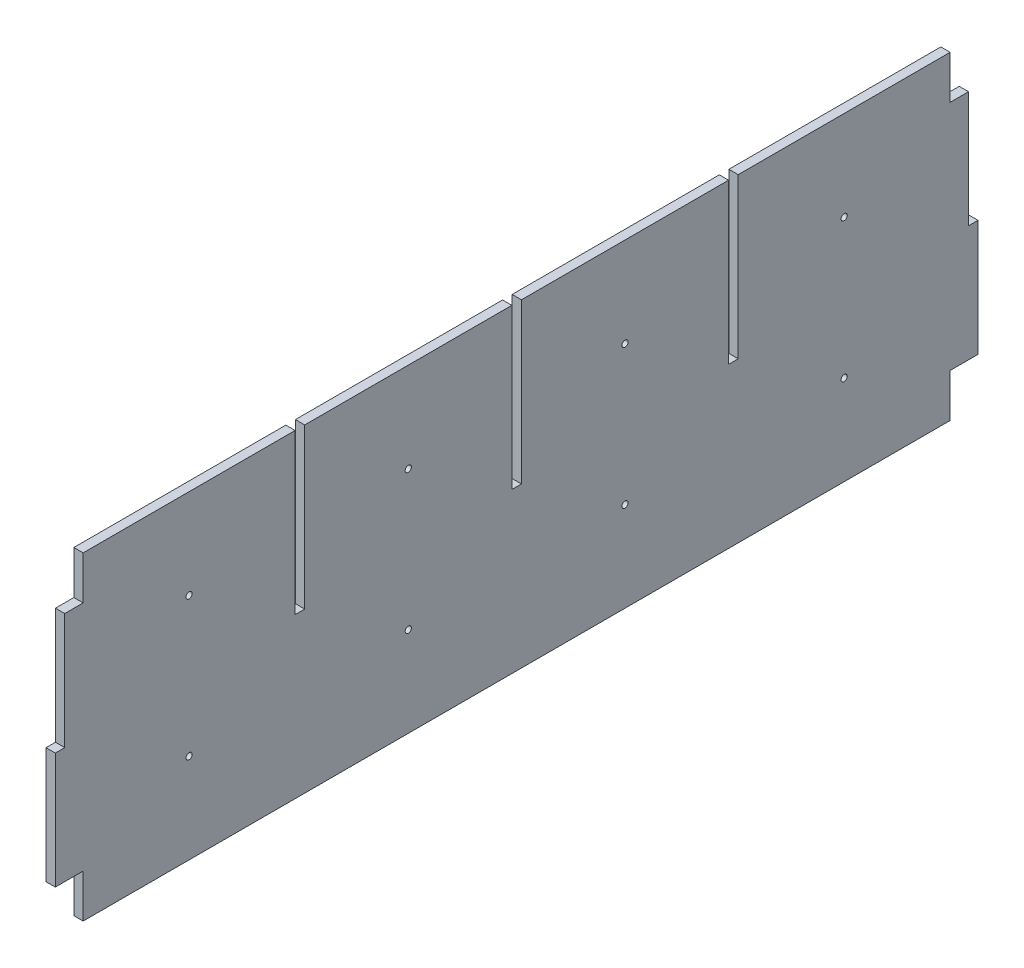
ISO-10303-21;
HEADER;
FILE_DESCRIPTION(('STEP AP214'),'2;1');
FILE_NAME('part.step','',(''),(''),'','','');
FILE_SCHEMA(('AUTOMOTIVE_DESIGN { 1 0 10303 214 1 1 1 1 }'));
ENDSEC;
DATA;
#1=APPLICATION_CONTEXT('core data for automotive mechanical design processes');
#2=APPLICATION_PROTOCOL_DEFINITION('international standard','automotive_design',2000,#1);
#3=PRODUCT_CONTEXT('',#1,'mechanical');
#4=PRODUCT('Part','Part','',(#3));
#5=PRODUCT_RELATED_PRODUCT_CATEGORY('part','',(#4));
#6=PRODUCT_DEFINITION_FORMATION('','',#4);
#7=PRODUCT_DEFINITION_CONTEXT('part definition',#1,'design');
#8=PRODUCT_DEFINITION('design','',#6,#7);
#9=PRODUCT_DEFINITION_SHAPE('','',#8);
#10=(LENGTH_UNIT() NAMED_UNIT(*) SI_UNIT(.MILLI.,.METRE.));
#11=(NAMED_UNIT(*) PLANE_ANGLE_UNIT() SI_UNIT($,.RADIAN.));
#12=(NAMED_UNIT(*) SI_UNIT($,.STERADIAN.) SOLID_ANGLE_UNIT());
#13=UNCERTAINTY_MEASURE_WITH_UNIT(LENGTH_MEASURE(1.E-05),#10,'distance_accuracy_value','');
#14=(GEOMETRIC_REPRESENTATION_CONTEXT(3) GLOBAL_UNCERTAINTY_ASSIGNED_CONTEXT((#13)) GLOBAL_UNIT_ASSIGNED_CONTEXT((#10,
#11,#12)) REPRESENTATION_CONTEXT('',''));
#15=CARTESIAN_POINT('',(0.,0.,0.));
#16=DIRECTION('',(0.,0.,1.));
#17=DIRECTION('',(1.,0.,0.));
#18=AXIS2_PLACEMENT_3D('',#15,#16,#17);
#19=CARTESIAN_POINT('',(6.,10.,0.));
#20=DIRECTION('',(0.,0.,-1.));
#21=DIRECTION('',(-1.,0.,0.));
#22=AXIS2_PLACEMENT_3D('',#19,#20,#21);
#23=PLANE('',#22);
#24=DIRECTION('',(0.,-1.,0.));
#25=VECTOR('',#24,1.);
#26=CARTESIAN_POINT('',(0.,10.,0.));
#27=LINE('',#26,#25);
#28=CARTESIAN_POINT('',(0.,10.,0.));
#29=VERTEX_POINT('',#28);
#30=CARTESIAN_POINT('',(0.,-18.,0.));
#31=VERTEX_POINT('',#30);
#32=EDGE_CURVE('E237',#29,#31,#27,.T.);
#33=ORIENTED_EDGE('',*,*,#32,.T.);
#34=DIRECTION('',(1.,0.,0.));
#35=VECTOR('',#34,1.);
#36=CARTESIAN_POINT('',(6.,-18.,0.));
#37=LINE('',#36,#35);
#38=CARTESIAN_POINT('',(6.,-18.,0.));
#39=VERTEX_POINT('',#38);
#40=EDGE_CURVE('E47',#31,#39,#37,.T.);
#41=ORIENTED_EDGE('',*,*,#40,.T.);
#42=DIRECTION('',(0.,-1.,0.));
#43=VECTOR('',#42,1.);
#44=CARTESIAN_POINT('',(6.,10.,0.));
#45=LINE('',#44,#43);
#46=CARTESIAN_POINT('',(6.,10.,0.));
#47=VERTEX_POINT('',#46);
#48=EDGE_CURVE('E267',#47,#39,#45,.T.);
#49=ORIENTED_EDGE('',*,*,#48,.F.);
#50=DIRECTION('',(-1.,0.,0.));
#51=VECTOR('',#50,1.);
#52=CARTESIAN_POINT('',(6.,10.,0.));
#53=LINE('',#52,#51);
#54=EDGE_CURVE('E268',#47,#29,#53,.T.);
#55=ORIENTED_EDGE('',*,*,#54,.T.);
#56=EDGE_LOOP('',(#33,#41,#49,#55));
#57=FACE_BOUND('',#56,.T.);
#58=ADVANCED_FACE('F33',(#57),#23,.F.);
#59=CARTESIAN_POINT('',(6.,0.,-560.));
#60=DIRECTION('',(0.,0.,1.));
#61=DIRECTION('',(1.,0.,0.));
#62=AXIS2_PLACEMENT_3D('',#59,#60,#61);
#63=PLANE('',#62);
#64=DIRECTION('',(0.,1.,0.));
#65=VECTOR('',#64,1.);
#66=CARTESIAN_POINT('',(6.,0.,-560.));
#67=LINE('',#66,#65);
#68=CARTESIAN_POINT('',(6.,-18.,-560.));
#69=VERTEX_POINT('',#68);
#70=CARTESIAN_POINT('',(6.,10.,-560.));
#71=VERTEX_POINT('',#70);
#72=EDGE_CURVE('E231',#69,#71,#67,.T.);
#73=ORIENTED_EDGE('',*,*,#72,.F.);
#74=DIRECTION('',(1.,0.,0.));
#75=VECTOR('',#74,1.);
#76=CARTESIAN_POINT('',(0.,-18.,-560.));
#77=LINE('',#76,#75);
#78=CARTESIAN_POINT('',(0.,-18.,-560.));
#79=VERTEX_POINT('',#78);
#80=EDGE_CURVE('E217',#79,#69,#77,.T.);
#81=ORIENTED_EDGE('',*,*,#80,.F.);
#82=DIRECTION('',(0.,1.,0.));
#83=VECTOR('',#82,1.);
#84=CARTESIAN_POINT('',(0.,0.,-560.));
#85=LINE('',#84,#83);
#86=CARTESIAN_POINT('',(0.,10.,-560.));
#87=VERTEX_POINT('',#86);
#88=EDGE_CURVE('E229',#79,#87,#85,.T.);
#89=ORIENTED_EDGE('',*,*,#88,.T.);
#90=DIRECTION('',(-1.,0.,0.));
#91=VECTOR('',#90,1.);
#92=CARTESIAN_POINT('',(6.,10.,-560.));
#93=LINE('',#92,#91);
#94=EDGE_CURVE('E40',#71,#87,#93,.T.);
#95=ORIENTED_EDGE('',*,*,#94,.F.);
#96=EDGE_LOOP('',(#73,#81,#89,#95));
#97=FACE_BOUND('',#96,.T.);
#98=ADVANCED_FACE('F227',(#97),#63,.F.);
#99=CARTESIAN_POINT('',(6.,10.,-560.));
#100=DIRECTION('',(0.,1.,0.));
#101=DIRECTION('',(0.,0.,1.));
#102=AXIS2_PLACEMENT_3D('',#99,#100,#101);
#103=PLANE('',#102);
#104=DIRECTION('',(0.,0.,-1.));
#105=VECTOR('',#104,1.);
#106=CARTESIAN_POINT('',(0.,10.,-560.));
#107=LINE('',#106,#105);
#108=CARTESIAN_POINT('',(0.,10.,-578.));
#109=VERTEX_POINT('',#108);
#110=EDGE_CURVE('E236',#87,#109,#107,.T.);
#111=ORIENTED_EDGE('',*,*,#110,.T.);
#112=DIRECTION('',(-1.,0.,0.));
#113=VECTOR('',#112,1.);
#114=CARTESIAN_POINT('',(6.,10.,-578.));
#115=LINE('',#114,#113);
#116=CARTESIAN_POINT('',(6.,10.,-578.));
#117=VERTEX_POINT('',#116);
#118=EDGE_CURVE('E299',#117,#109,#115,.T.);
#119=ORIENTED_EDGE('',*,*,#118,.F.);
#120=DIRECTION('',(0.,0.,-1.));
#121=VECTOR('',#120,1.);
#122=CARTESIAN_POINT('',(6.,10.,-560.));
#123=LINE('',#122,#121);
#124=EDGE_CURVE('E305',#71,#117,#123,.T.);
#125=ORIENTED_EDGE('',*,*,#124,.F.);
#126=ORIENTED_EDGE('',*,*,#94,.T.);
#127=EDGE_LOOP('',(#111,#119,#125,#126));
#128=FACE_BOUND('',#127,.T.);
#129=ADVANCED_FACE('F303',(#128),#103,.F.);
#130=CARTESIAN_POINT('',(6.,10.,-578.));
#131=DIRECTION('',(0.,0.,1.));
#132=DIRECTION('',(1.,0.,0.));
#133=AXIS2_PLACEMENT_3D('',#130,#131,#132);
#134=PLANE('',#133);
#135=DIRECTION('',(0.,1.,0.));
#136=VECTOR('',#135,1.);
#137=CARTESIAN_POINT('',(0.,10.,-578.));
#138=LINE('',#137,#136);
#139=CARTESIAN_POINT('',(0.,85.,-578.));
#140=VERTEX_POINT('',#139);
#141=EDGE_CURVE('E239',#109,#140,#138,.T.);
#142=ORIENTED_EDGE('',*,*,#141,.T.);
#143=DIRECTION('',(-1.,0.,0.));
#144=VECTOR('',#143,1.);
#145=CARTESIAN_POINT('',(6.,85.,-578.));
#146=LINE('',#145,#144);
#147=CARTESIAN_POINT('',(6.,85.,-578.));
#148=VERTEX_POINT('',#147);
#149=EDGE_CURVE('E296',#148,#140,#146,.T.);
#150=ORIENTED_EDGE('',*,*,#149,.F.);
#151=DIRECTION('',(0.,1.,0.));
#152=VECTOR('',#151,1.);
#153=CARTESIAN_POINT('',(6.,10.,-578.));
#154=LINE('',#153,#152);
#155=EDGE_CURVE('E308',#117,#148,#154,.T.);
#156=ORIENTED_EDGE('',*,*,#155,.F.);
#157=ORIENTED_EDGE('',*,*,#118,.T.);
#158=EDGE_LOOP('',(#142,#150,#156,#157));
#159=FACE_BOUND('',#158,.T.);
#160=ADVANCED_FACE('F508',(#159),#134,.F.);
#161=CARTESIAN_POINT('',(6.,85.,-578.));
#162=DIRECTION('',(0.,-1.,0.));
#163=DIRECTION('',(0.,0.,-1.));
#164=AXIS2_PLACEMENT_3D('',#161,#162,#163);
#165=PLANE('',#164);
#166=DIRECTION('',(0.,0.,1.));
#167=VECTOR('',#166,1.);
#168=CARTESIAN_POINT('',(0.,85.,-578.));
#169=LINE('',#168,#167);
#170=CARTESIAN_POINT('',(0.,85.,-571.9));
#171=VERTEX_POINT('',#170);
#172=EDGE_CURVE('E246',#140,#171,#169,.T.);
#173=ORIENTED_EDGE('',*,*,#172,.T.);
#174=DIRECTION('',(-1.,0.,0.));
#175=VECTOR('',#174,1.);
#176=CARTESIAN_POINT('',(6.,85.,-571.9));
#177=LINE('',#176,#175);
#178=CARTESIAN_POINT('',(6.,85.,-571.9));
#179=VERTEX_POINT('',#178);
#180=EDGE_CURVE('E293',#179,#171,#177,.T.);
#181=ORIENTED_EDGE('',*,*,#180,.F.);
#182=DIRECTION('',(0.,0.,1.));
#183=VECTOR('',#182,1.);
#184=CARTESIAN_POINT('',(6.,85.,-578.));
#185=LINE('',#184,#183);
#186=EDGE_CURVE('E310',#148,#179,#185,.T.);
#187=ORIENTED_EDGE('',*,*,#186,.F.);
#188=ORIENTED_EDGE('',*,*,#149,.T.);
#189=EDGE_LOOP('',(#173,#181,#187,#188));
#190=FACE_BOUND('',#189,.T.);
#191=ADVANCED_FACE('F505',(#190),#165,.F.);
#192=CARTESIAN_POINT('',(6.,85.,-571.9));
#193=DIRECTION('',(0.,0.,1.));
#194=DIRECTION('',(1.,0.,0.));
#195=AXIS2_PLACEMENT_3D('',#192,#193,#194);
#196=PLANE('',#195);
#197=DIRECTION('',(0.,1.,0.));
#198=VECTOR('',#197,1.);
#199=CARTESIAN_POINT('',(0.,85.,-571.9));
#200=LINE('',#199,#198);
#201=CARTESIAN_POINT('',(0.,160.,-571.9));
#202=VERTEX_POINT('',#201);
#203=EDGE_CURVE('E248',#171,#202,#200,.T.);
#204=ORIENTED_EDGE('',*,*,#203,.T.);
#205=DIRECTION('',(-1.,0.,0.));
#206=VECTOR('',#205,1.);
#207=CARTESIAN_POINT('',(6.,160.,-571.9));
#208=LINE('',#207,#206);
#209=CARTESIAN_POINT('',(6.,160.,-571.9));
#210=VERTEX_POINT('',#209);
#211=EDGE_CURVE('E290',#210,#202,#208,.T.);
#212=ORIENTED_EDGE('',*,*,#211,.F.);
#213=DIRECTION('',(0.,1.,0.));
#214=VECTOR('',#213,1.);
#215=CARTESIAN_POINT('',(6.,85.,-571.9));
#216=LINE('',#215,#214);
#217=EDGE_CURVE('E316',#179,#210,#216,.T.);
#218=ORIENTED_EDGE('',*,*,#217,.F.);
#219=ORIENTED_EDGE('',*,*,#180,.T.);
#220=EDGE_LOOP('',(#204,#212,#218,#219));
#221=FACE_BOUND('',#220,.T.);
#222=ADVANCED_FACE('F500',(#221),#196,.F.);
#223=CARTESIAN_POINT('',(6.,160.,-571.9));
#224=DIRECTION('',(0.,-1.,0.));
#225=DIRECTION('',(0.,0.,-1.));
#226=AXIS2_PLACEMENT_3D('',#223,#224,#225);
#227=PLANE('',#226);
#228=DIRECTION('',(0.,0.,1.));
#229=VECTOR('',#228,1.);
#230=CARTESIAN_POINT('',(0.,160.,-571.9));
#231=LINE('',#230,#229);
#232=CARTESIAN_POINT('',(0.,160.,-560.));
#233=VERTEX_POINT('',#232);
#234=EDGE_CURVE('E250',#202,#233,#231,.T.);
#235=ORIENTED_EDGE('',*,*,#234,.T.);
#236=DIRECTION('',(-1.,0.,0.));
#237=VECTOR('',#236,1.);
#238=CARTESIAN_POINT('',(6.,160.,-560.));
#239=LINE('',#238,#237);
#240=CARTESIAN_POINT('',(6.,160.,-560.));
#241=VERTEX_POINT('',#240);
#242=EDGE_CURVE('E287',#241,#233,#239,.T.);
#243=ORIENTED_EDGE('',*,*,#242,.F.);
#244=DIRECTION('',(0.,0.,1.));
#245=VECTOR('',#244,1.);
#246=CARTESIAN_POINT('',(6.,160.,-571.9));
#247=LINE('',#246,#245);
#248=EDGE_CURVE('E318',#210,#241,#247,.T.);
#249=ORIENTED_EDGE('',*,*,#248,.F.);
#250=ORIENTED_EDGE('',*,*,#211,.T.);
#251=EDGE_LOOP('',(#235,#243,#249,#250));
#252=FACE_BOUND('',#251,.T.);
#253=ADVANCED_FACE('F495',(#252),#227,.F.);
#254=CARTESIAN_POINT('',(6.,160.,-560.));
#255=DIRECTION('',(0.,0.,1.));
#256=DIRECTION('',(1.,0.,0.));
#257=AXIS2_PLACEMENT_3D('',#254,#255,#256);
#258=PLANE('',#257);
#259=DIRECTION('',(0.,1.,0.));
#260=VECTOR('',#259,1.);
#261=CARTESIAN_POINT('',(0.,160.,-560.));
#262=LINE('',#261,#260);
#263=CARTESIAN_POINT('',(0.,188.,-560.));
#264=VERTEX_POINT('',#263);
#265=EDGE_CURVE('E252',#233,#264,#262,.T.);
#266=ORIENTED_EDGE('',*,*,#265,.T.);
#267=DIRECTION('',(-1.,0.,0.));
#268=VECTOR('',#267,1.);
#269=CARTESIAN_POINT('',(6.,188.,-560.));
#270=LINE('',#269,#268);
#271=CARTESIAN_POINT('',(6.,188.,-560.));
#272=VERTEX_POINT('',#271);
#273=EDGE_CURVE('E476',#272,#264,#270,.T.);
#274=ORIENTED_EDGE('',*,*,#273,.F.);
#275=DIRECTION('',(0.,1.,0.));
#276=VECTOR('',#275,1.);
#277=CARTESIAN_POINT('',(6.,160.,-560.));
#278=LINE('',#277,#276);
#279=EDGE_CURVE('E320',#241,#272,#278,.T.);
#280=ORIENTED_EDGE('',*,*,#279,.F.);
#281=ORIENTED_EDGE('',*,*,#242,.T.);
#282=EDGE_LOOP('',(#266,#274,#280,#281));
#283=FACE_BOUND('',#282,.T.);
#284=ADVANCED_FACE('F491',(#283),#258,.F.);
#285=CARTESIAN_POINT('',(6.,170.,0.));
#286=DIRECTION('',(0.,0.,-1.));
#287=DIRECTION('',(-1.,0.,0.));
#288=AXIS2_PLACEMENT_3D('',#285,#286,#287);
#289=PLANE('',#288);
#290=DIRECTION('',(0.,-1.,0.));
#291=VECTOR('',#290,1.);
#292=CARTESIAN_POINT('',(6.,170.,0.));
#293=LINE('',#292,#291);
#294=CARTESIAN_POINT('',(6.,188.,0.));
#295=VERTEX_POINT('',#294);
#296=CARTESIAN_POINT('',(6.,160.,0.));
#297=VERTEX_POINT('',#296);
#298=EDGE_CURVE('E323',#295,#297,#293,.T.);
#299=ORIENTED_EDGE('',*,*,#298,.F.);
#300=DIRECTION('',(-1.,0.,0.));
#301=VECTOR('',#300,1.);
#302=CARTESIAN_POINT('',(6.,188.,0.));
#303=LINE('',#302,#301);
#304=CARTESIAN_POINT('',(0.,188.,0.));
#305=VERTEX_POINT('',#304);
#306=EDGE_CURVE('E418',#295,#305,#303,.T.);
#307=ORIENTED_EDGE('',*,*,#306,.T.);
#308=DIRECTION('',(0.,-1.,0.));
#309=VECTOR('',#308,1.);
#310=CARTESIAN_POINT('',(0.,170.,0.));
#311=LINE('',#310,#309);
#312=CARTESIAN_POINT('',(0.,160.,0.));
#313=VERTEX_POINT('',#312);
#314=EDGE_CURVE('E255',#305,#313,#311,.T.);
#315=ORIENTED_EDGE('',*,*,#314,.T.);
#316=DIRECTION('',(-1.,0.,0.));
#317=VECTOR('',#316,1.);
#318=CARTESIAN_POINT('',(6.,160.,0.));
#319=LINE('',#318,#317);
#320=EDGE_CURVE('E284',#297,#313,#319,.T.);
#321=ORIENTED_EDGE('',*,*,#320,.F.);
#322=EDGE_LOOP('',(#299,#307,#315,#321));
#323=FACE_BOUND('',#322,.T.);
#324=ADVANCED_FACE('F592',(#323),#289,.F.);
#325=CARTESIAN_POINT('',(6.,160.,0.));
#326=DIRECTION('',(0.,-1.,0.));
#327=DIRECTION('',(0.,0.,-1.));
#328=AXIS2_PLACEMENT_3D('',#325,#326,#327);
#329=PLANE('',#328);
#330=DIRECTION('',(0.,0.,1.));
#331=VECTOR('',#330,1.);
#332=CARTESIAN_POINT('',(0.,160.,0.));
#333=LINE('',#332,#331);
#334=CARTESIAN_POINT('',(0.,160.,11.9));
#335=VERTEX_POINT('',#334);
#336=EDGE_CURVE('E257',#313,#335,#333,.T.);
#337=ORIENTED_EDGE('',*,*,#336,.T.);
#338=DIRECTION('',(-1.,0.,0.));
#339=VECTOR('',#338,1.);
#340=CARTESIAN_POINT('',(6.,160.,11.9));
#341=LINE('',#340,#339);
#342=CARTESIAN_POINT('',(6.,160.,11.9));
#343=VERTEX_POINT('',#342);
#344=EDGE_CURVE('E281',#343,#335,#341,.T.);
#345=ORIENTED_EDGE('',*,*,#344,.F.);
#346=DIRECTION('',(0.,0.,1.));
#347=VECTOR('',#346,1.);
#348=CARTESIAN_POINT('',(6.,160.,0.));
#349=LINE('',#348,#347);
#350=EDGE_CURVE('E325',#297,#343,#349,.T.);
#351=ORIENTED_EDGE('',*,*,#350,.F.);
#352=ORIENTED_EDGE('',*,*,#320,.T.);
#353=EDGE_LOOP('',(#337,#345,#351,#352));
#354=FACE_BOUND('',#353,.T.);
#355=ADVANCED_FACE('F595',(#354),#329,.F.);
#356=CARTESIAN_POINT('',(6.,160.,11.9));
#357=DIRECTION('',(0.,0.,-1.));
#358=DIRECTION('',(-1.,0.,0.));
#359=AXIS2_PLACEMENT_3D('',#356,#357,#358);
#360=PLANE('',#359);
#361=DIRECTION('',(0.,-1.,0.));
#362=VECTOR('',#361,1.);
#363=CARTESIAN_POINT('',(0.,160.,11.9));
#364=LINE('',#363,#362);
#365=CARTESIAN_POINT('',(0.,85.,11.9));
#366=VERTEX_POINT('',#365);
#367=EDGE_CURVE('E259',#335,#366,#364,.T.);
#368=ORIENTED_EDGE('',*,*,#367,.T.);
#369=DIRECTION('',(-1.,0.,0.));
#370=VECTOR('',#369,1.);
#371=CARTESIAN_POINT('',(6.,85.,11.9));
#372=LINE('',#371,#370);
#373=CARTESIAN_POINT('',(6.,85.,11.9));
#374=VERTEX_POINT('',#373);
#375=EDGE_CURVE('E278',#374,#366,#372,.T.);
#376=ORIENTED_EDGE('',*,*,#375,.F.);
#377=DIRECTION('',(0.,-1.,0.));
#378=VECTOR('',#377,1.);
#379=CARTESIAN_POINT('',(6.,160.,11.9));
#380=LINE('',#379,#378);
#381=EDGE_CURVE('E327',#343,#374,#380,.T.);
#382=ORIENTED_EDGE('',*,*,#381,.F.);
#383=ORIENTED_EDGE('',*,*,#344,.T.);
#384=EDGE_LOOP('',(#368,#376,#382,#383));
#385=FACE_BOUND('',#384,.T.);
#386=ADVANCED_FACE('F599',(#385),#360,.F.);
#387=CARTESIAN_POINT('',(6.,85.,11.9));
#388=DIRECTION('',(0.,-1.,0.));
#389=DIRECTION('',(0.,0.,-1.));
#390=AXIS2_PLACEMENT_3D('',#387,#388,#389);
#391=PLANE('',#390);
#392=DIRECTION('',(0.,0.,1.));
#393=VECTOR('',#392,1.);
#394=CARTESIAN_POINT('',(0.,85.,11.9));
#395=LINE('',#394,#393);
#396=CARTESIAN_POINT('',(0.,85.,18.));
#397=VERTEX_POINT('',#396);
#398=EDGE_CURVE('E261',#366,#397,#395,.T.);
#399=ORIENTED_EDGE('',*,*,#398,.T.);
#400=DIRECTION('',(-1.,0.,0.));
#401=VECTOR('',#400,1.);
#402=CARTESIAN_POINT('',(6.,85.,18.));
#403=LINE('',#402,#401);
#404=CARTESIAN_POINT('',(6.,85.,18.));
#405=VERTEX_POINT('',#404);
#406=EDGE_CURVE('E275',#405,#397,#403,.T.);
#407=ORIENTED_EDGE('',*,*,#406,.F.);
#408=DIRECTION('',(0.,0.,1.));
#409=VECTOR('',#408,1.);
#410=CARTESIAN_POINT('',(6.,85.,11.9));
#411=LINE('',#410,#409);
#412=EDGE_CURVE('E329',#374,#405,#411,.T.);
#413=ORIENTED_EDGE('',*,*,#412,.F.);
#414=ORIENTED_EDGE('',*,*,#375,.T.);
#415=EDGE_LOOP('',(#399,#407,#413,#414));
#416=FACE_BOUND('',#415,.T.);
#417=ADVANCED_FACE('F603',(#416),#391,.F.);
#418=CARTESIAN_POINT('',(6.,85.,18.));
#419=DIRECTION('',(0.,0.,-1.));
#420=DIRECTION('',(-1.,0.,0.));
#421=AXIS2_PLACEMENT_3D('',#418,#419,#420);
#422=PLANE('',#421);
#423=DIRECTION('',(0.,-1.,0.));
#424=VECTOR('',#423,1.);
#425=CARTESIAN_POINT('',(0.,85.,18.));
#426=LINE('',#425,#424);
#427=CARTESIAN_POINT('',(0.,10.,18.));
#428=VERTEX_POINT('',#427);
#429=EDGE_CURVE('E263',#397,#428,#426,.T.);
#430=ORIENTED_EDGE('',*,*,#429,.T.);
#431=DIRECTION('',(-1.,0.,0.));
#432=VECTOR('',#431,1.);
#433=CARTESIAN_POINT('',(6.,10.,18.));
#434=LINE('',#433,#432);
#435=CARTESIAN_POINT('',(6.,10.,18.));
#436=VERTEX_POINT('',#435);
#437=EDGE_CURVE('E271',#436,#428,#434,.T.);
#438=ORIENTED_EDGE('',*,*,#437,.F.);
#439=DIRECTION('',(0.,-1.,0.));
#440=VECTOR('',#439,1.);
#441=CARTESIAN_POINT('',(6.,85.,18.));
#442=LINE('',#441,#440);
#443=EDGE_CURVE('E331',#405,#436,#442,.T.);
#444=ORIENTED_EDGE('',*,*,#443,.F.);
#445=ORIENTED_EDGE('',*,*,#406,.T.);
#446=EDGE_LOOP('',(#430,#438,#444,#445));
#447=FACE_BOUND('',#446,.T.);
#448=ADVANCED_FACE('F607',(#447),#422,.F.);
#449=CARTESIAN_POINT('',(6.,10.,18.));
#450=DIRECTION('',(0.,1.,0.));
#451=DIRECTION('',(0.,0.,1.));
#452=AXIS2_PLACEMENT_3D('',#449,#450,#451);
#453=PLANE('',#452);
#454=DIRECTION('',(0.,0.,-1.));
#455=VECTOR('',#454,1.);
#456=CARTESIAN_POINT('',(0.,10.,18.));
#457=LINE('',#456,#455);
#458=EDGE_CURVE('E265',#428,#29,#457,.T.);
#459=ORIENTED_EDGE('',*,*,#458,.T.);
#460=ORIENTED_EDGE('',*,*,#54,.F.);
#461=DIRECTION('',(0.,0.,-1.));
#462=VECTOR('',#461,1.);
#463=CARTESIAN_POINT('',(6.,10.,18.));
#464=LINE('',#463,#462);
#465=EDGE_CURVE('E272',#436,#47,#464,.T.);
#466=ORIENTED_EDGE('',*,*,#465,.F.);
#467=ORIENTED_EDGE('',*,*,#437,.T.);
#468=EDGE_LOOP('',(#459,#460,#466,#467));
#469=FACE_BOUND('',#468,.T.);
#470=ADVANCED_FACE('F341',(#469),#453,.F.);
#471=CARTESIAN_POINT('',(6.,0.,0.));
#472=DIRECTION('',(1.,0.,0.));
#473=DIRECTION('',(0.,0.,-1.));
#474=AXIS2_PLACEMENT_3D('',#471,#472,#473);
#475=PLANE('',#474);
#476=DIRECTION('',(0.,0.,-1.));
#477=VECTOR('',#476,1.);
#478=CARTESIAN_POINT('',(6.,-18.,440.));
#479=LINE('',#478,#477);
#480=EDGE_CURVE('E223',#39,#69,#479,.T.);
#481=ORIENTED_EDGE('',*,*,#480,.T.);
#482=ORIENTED_EDGE('',*,*,#72,.T.);
#483=ORIENTED_EDGE('',*,*,#124,.T.);
#484=ORIENTED_EDGE('',*,*,#155,.T.);
#485=ORIENTED_EDGE('',*,*,#186,.T.);
#486=ORIENTED_EDGE('',*,*,#217,.T.);
#487=ORIENTED_EDGE('',*,*,#248,.T.);
#488=ORIENTED_EDGE('',*,*,#279,.T.);
#489=DIRECTION('',(0.,0.,-1.));
#490=VECTOR('',#489,1.);
#491=CARTESIAN_POINT('',(6.,188.,440.));
#492=LINE('',#491,#490);
#493=CARTESIAN_POINT('',(6.,188.,-423.1));
#494=VERTEX_POINT('',#493);
#495=EDGE_CURVE('E473',#494,#272,#492,.T.);
#496=ORIENTED_EDGE('',*,*,#495,.F.);
#497=DIRECTION('',(0.,1.,0.));
#498=VECTOR('',#497,1.);
#499=CARTESIAN_POINT('',(6.,170.,-423.1));
#500=LINE('',#499,#498);
#501=CARTESIAN_POINT('',(6.,85.,-423.1));
#502=VERTEX_POINT('',#501);
#503=EDGE_CURVE('E373',#502,#494,#500,.T.);
#504=ORIENTED_EDGE('',*,*,#503,.F.);
#505=DIRECTION('',(0.,0.,-1.));
#506=VECTOR('',#505,1.);
#507=CARTESIAN_POINT('',(6.,85.,-416.9));
#508=LINE('',#507,#506);
#509=CARTESIAN_POINT('',(6.,85.,-416.9));
#510=VERTEX_POINT('',#509);
#511=EDGE_CURVE('E377',#510,#502,#508,.T.);
#512=ORIENTED_EDGE('',*,*,#511,.F.);
#513=DIRECTION('',(0.,-1.,0.));
#514=VECTOR('',#513,1.);
#515=CARTESIAN_POINT('',(6.,170.,-416.9));
#516=LINE('',#515,#514);
#517=CARTESIAN_POINT('',(6.,188.,-416.9));
#518=VERTEX_POINT('',#517);
#519=EDGE_CURVE('E380',#518,#510,#516,.T.);
#520=ORIENTED_EDGE('',*,*,#519,.F.);
#521=CARTESIAN_POINT('',(6.,188.,-283.1));
#522=VERTEX_POINT('',#521);
#523=EDGE_CURVE('E475',#522,#518,#492,.T.);
#524=ORIENTED_EDGE('',*,*,#523,.F.);
#525=DIRECTION('',(0.,1.,0.));
#526=VECTOR('',#525,1.);
#527=CARTESIAN_POINT('',(6.,170.,-283.1));
#528=LINE('',#527,#526);
#529=CARTESIAN_POINT('',(6.,85.,-283.1));
#530=VERTEX_POINT('',#529);
#531=EDGE_CURVE('E394',#530,#522,#528,.T.);
#532=ORIENTED_EDGE('',*,*,#531,.F.);
#533=DIRECTION('',(0.,0.,-1.));
#534=VECTOR('',#533,1.);
#535=CARTESIAN_POINT('',(6.,85.,-276.9));
#536=LINE('',#535,#534);
#537=CARTESIAN_POINT('',(6.,85.,-276.9));
#538=VERTEX_POINT('',#537);
#539=EDGE_CURVE('E398',#538,#530,#536,.T.);
#540=ORIENTED_EDGE('',*,*,#539,.F.);
#541=DIRECTION('',(0.,-1.,0.));
#542=VECTOR('',#541,1.);
#543=CARTESIAN_POINT('',(6.,170.,-276.9));
#544=LINE('',#543,#542);
#545=CARTESIAN_POINT('',(6.,188.,-276.9));
#546=VERTEX_POINT('',#545);
#547=EDGE_CURVE('E372',#546,#538,#544,.T.);
#548=ORIENTED_EDGE('',*,*,#547,.F.);
#549=CARTESIAN_POINT('',(6.,188.,-143.1));
#550=VERTEX_POINT('',#549);
#551=EDGE_CURVE('E549',#550,#546,#492,.T.);
#552=ORIENTED_EDGE('',*,*,#551,.F.);
#553=DIRECTION('',(0.,1.,0.));
#554=VECTOR('',#553,1.);
#555=CARTESIAN_POINT('',(6.,170.,-143.1));
#556=LINE('',#555,#554);
#557=CARTESIAN_POINT('',(6.,85.,-143.1));
#558=VERTEX_POINT('',#557);
#559=EDGE_CURVE('E350',#558,#550,#556,.T.);
#560=ORIENTED_EDGE('',*,*,#559,.F.);
#561=DIRECTION('',(0.,0.,-1.));
#562=VECTOR('',#561,1.);
#563=CARTESIAN_POINT('',(6.,85.,-136.9));
#564=LINE('',#563,#562);
#565=CARTESIAN_POINT('',(6.,85.,-136.9));
#566=VERTEX_POINT('',#565);
#567=EDGE_CURVE('E354',#566,#558,#564,.T.);
#568=ORIENTED_EDGE('',*,*,#567,.F.);
#569=DIRECTION('',(0.,-1.,0.));
#570=VECTOR('',#569,1.);
#571=CARTESIAN_POINT('',(6.,170.,-136.9));
#572=LINE('',#571,#570);
#573=CARTESIAN_POINT('',(6.,188.,-136.9));
#574=VERTEX_POINT('',#573);
#575=EDGE_CURVE('E357',#574,#566,#572,.T.);
#576=ORIENTED_EDGE('',*,*,#575,.F.);
#577=EDGE_CURVE('E55',#295,#574,#492,.T.);
#578=ORIENTED_EDGE('',*,*,#577,.F.);
#579=ORIENTED_EDGE('',*,*,#298,.T.);
#580=ORIENTED_EDGE('',*,*,#350,.T.);
#581=ORIENTED_EDGE('',*,*,#381,.T.);
#582=ORIENTED_EDGE('',*,*,#412,.T.);
#583=ORIENTED_EDGE('',*,*,#443,.T.);
#584=ORIENTED_EDGE('',*,*,#465,.T.);
#585=ORIENTED_EDGE('',*,*,#48,.T.);
#586=EDGE_LOOP('',(#481,#482,#483,#484,#485,#486,#487,#488,#496,#504,#512,#520,#524,#532,#540,
#548,#552,#560,#568,#576,#578,#579,#580,#581,#582,#583,#584,#585));
#587=FACE_BOUND('',#586,.T.);
#588=CARTESIAN_POINT('',(6.,40.,-68.45));
#589=DIRECTION('',(1.,0.,0.));
#590=DIRECTION('',(0.,0.,-1.));
#591=AXIS2_PLACEMENT_3D('',#588,#589,#590);
#592=CIRCLE('',#591,2.);
#593=CARTESIAN_POINT('',(6.,40.,-70.45));
#594=VERTEX_POINT('',#593);
#595=EDGE_CURVE('E451',#594,#594,#592,.T.);
#596=ORIENTED_EDGE('',*,*,#595,.F.);
#597=EDGE_LOOP('',(#596));
#598=FACE_BOUND('',#597,.T.);
#599=CARTESIAN_POINT('',(6.,130.,-210.));
#600=DIRECTION('',(1.,0.,0.));
#601=DIRECTION('',(0.,0.,-1.));
#602=AXIS2_PLACEMENT_3D('',#599,#600,#601);
#603=CIRCLE('',#602,2.);
#604=CARTESIAN_POINT('',(6.,130.,-212.));
#605=VERTEX_POINT('',#604);
#606=EDGE_CURVE('E445',#605,#605,#603,.T.);
#607=ORIENTED_EDGE('',*,*,#606,.F.);
#608=EDGE_LOOP('',(#607));
#609=FACE_BOUND('',#608,.T.);
#610=CARTESIAN_POINT('',(6.,40.,-210.));
#611=DIRECTION('',(1.,0.,0.));
#612=DIRECTION('',(0.,0.,-1.));
#613=AXIS2_PLACEMENT_3D('',#610,#611,#612);
#614=CIRCLE('',#613,2.);
#615=CARTESIAN_POINT('',(6.,40.,-212.));
#616=VERTEX_POINT('',#615);
#617=EDGE_CURVE('E439',#616,#616,#614,.T.);
#618=ORIENTED_EDGE('',*,*,#617,.F.);
#619=EDGE_LOOP('',(#618));
#620=FACE_BOUND('',#619,.T.);
#621=CARTESIAN_POINT('',(6.,130.,-350.));
#622=DIRECTION('',(1.,0.,0.));
#623=DIRECTION('',(0.,0.,-1.));
#624=AXIS2_PLACEMENT_3D('',#621,#622,#623);
#625=CIRCLE('',#624,2.);
#626=CARTESIAN_POINT('',(6.,130.,-352.));
#627=VERTEX_POINT('',#626);
#628=EDGE_CURVE('E433',#627,#627,#625,.T.);
#629=ORIENTED_EDGE('',*,*,#628,.F.);
#630=EDGE_LOOP('',(#629));
#631=FACE_BOUND('',#630,.T.);
#632=CARTESIAN_POINT('',(6.,40.,-350.));
#633=DIRECTION('',(1.,0.,0.));
#634=DIRECTION('',(0.,0.,-1.));
#635=AXIS2_PLACEMENT_3D('',#632,#633,#634);
#636=CIRCLE('',#635,2.);
#637=CARTESIAN_POINT('',(6.,40.,-352.));
#638=VERTEX_POINT('',#637);
#639=EDGE_CURVE('E427',#638,#638,#636,.T.);
#640=ORIENTED_EDGE('',*,*,#639,.F.);
#641=EDGE_LOOP('',(#640));
#642=FACE_BOUND('',#641,.T.);
#643=CARTESIAN_POINT('',(6.,130.,-491.55));
#644=DIRECTION('',(1.,0.,0.));
#645=DIRECTION('',(0.,0.,-1.));
#646=AXIS2_PLACEMENT_3D('',#643,#644,#645);
#647=CIRCLE('',#646,2.);
#648=CARTESIAN_POINT('',(6.,130.,-493.55));
#649=VERTEX_POINT('',#648);
#650=EDGE_CURVE('E421',#649,#649,#647,.T.);
#651=ORIENTED_EDGE('',*,*,#650,.F.);
#652=EDGE_LOOP('',(#651));
#653=FACE_BOUND('',#652,.T.);
#654=CARTESIAN_POINT('',(6.,40.,-491.55));
#655=DIRECTION('',(1.,0.,0.));
#656=DIRECTION('',(0.,0.,-1.));
#657=AXIS2_PLACEMENT_3D('',#654,#655,#656);
#658=CIRCLE('',#657,2.);
#659=CARTESIAN_POINT('',(6.,40.,-493.55));
#660=VERTEX_POINT('',#659);
#661=EDGE_CURVE('E414',#660,#660,#658,.T.);
#662=ORIENTED_EDGE('',*,*,#661,.F.);
#663=EDGE_LOOP('',(#662));
#664=FACE_BOUND('',#663,.T.);
#665=CARTESIAN_POINT('',(6.,130.,-68.45));
#666=DIRECTION('',(1.,0.,0.));
#667=DIRECTION('',(0.,0.,-1.));
#668=AXIS2_PLACEMENT_3D('',#665,#666,#667);
#669=CIRCLE('',#668,2.);
#670=CARTESIAN_POINT('',(6.,130.,-70.45));
#671=VERTEX_POINT('',#670);
#672=EDGE_CURVE('E408',#671,#671,#669,.T.);
#673=ORIENTED_EDGE('',*,*,#672,.F.);
#674=EDGE_LOOP('',(#673));
#675=FACE_BOUND('',#674,.T.);
#676=ADVANCED_FACE('F335',(#587,#598,#609,#620,#631,#642,#653,#664,#675),#475,.T.);
#677=CARTESIAN_POINT('',(0.,0.,0.));
#678=DIRECTION('',(1.,0.,0.));
#679=DIRECTION('',(0.,0.,-1.));
#680=AXIS2_PLACEMENT_3D('',#677,#678,#679);
#681=PLANE('',#680);
#682=CARTESIAN_POINT('',(0.,40.,-68.45));
#683=DIRECTION('',(1.,0.,0.));
#684=DIRECTION('',(0.,0.,-1.));
#685=AXIS2_PLACEMENT_3D('',#682,#683,#684);
#686=CIRCLE('',#685,2.);
#687=CARTESIAN_POINT('',(0.,40.,-70.45));
#688=VERTEX_POINT('',#687);
#689=EDGE_CURVE('E411',#688,#688,#686,.T.);
#690=ORIENTED_EDGE('',*,*,#689,.T.);
#691=EDGE_LOOP('',(#690));
#692=FACE_BOUND('',#691,.T.);
#693=CARTESIAN_POINT('',(0.,130.,-210.));
#694=DIRECTION('',(1.,0.,0.));
#695=DIRECTION('',(0.,0.,-1.));
#696=AXIS2_PLACEMENT_3D('',#693,#694,#695);
#697=CIRCLE('',#696,2.);
#698=CARTESIAN_POINT('',(0.,130.,-212.));
#699=VERTEX_POINT('',#698);
#700=EDGE_CURVE('E448',#699,#699,#697,.T.);
#701=ORIENTED_EDGE('',*,*,#700,.T.);
#702=EDGE_LOOP('',(#701));
#703=FACE_BOUND('',#702,.T.);
#704=CARTESIAN_POINT('',(0.,40.,-210.));
#705=DIRECTION('',(1.,0.,0.));
#706=DIRECTION('',(0.,0.,-1.));
#707=AXIS2_PLACEMENT_3D('',#704,#705,#706);
#708=CIRCLE('',#707,2.);
#709=CARTESIAN_POINT('',(0.,40.,-212.));
#710=VERTEX_POINT('',#709);
#711=EDGE_CURVE('E442',#710,#710,#708,.T.);
#712=ORIENTED_EDGE('',*,*,#711,.T.);
#713=EDGE_LOOP('',(#712));
#714=FACE_BOUND('',#713,.T.);
#715=CARTESIAN_POINT('',(0.,130.,-350.));
#716=DIRECTION('',(1.,0.,0.));
#717=DIRECTION('',(0.,0.,-1.));
#718=AXIS2_PLACEMENT_3D('',#715,#716,#717);
#719=CIRCLE('',#718,2.);
#720=CARTESIAN_POINT('',(0.,130.,-352.));
#721=VERTEX_POINT('',#720);
#722=EDGE_CURVE('E436',#721,#721,#719,.T.);
#723=ORIENTED_EDGE('',*,*,#722,.T.);
#724=EDGE_LOOP('',(#723));
#725=FACE_BOUND('',#724,.T.);
#726=CARTESIAN_POINT('',(0.,40.,-350.));
#727=DIRECTION('',(1.,0.,0.));
#728=DIRECTION('',(0.,0.,-1.));
#729=AXIS2_PLACEMENT_3D('',#726,#727,#728);
#730=CIRCLE('',#729,2.);
#731=CARTESIAN_POINT('',(0.,40.,-352.));
#732=VERTEX_POINT('',#731);
#733=EDGE_CURVE('E430',#732,#732,#730,.T.);
#734=ORIENTED_EDGE('',*,*,#733,.T.);
#735=EDGE_LOOP('',(#734));
#736=FACE_BOUND('',#735,.T.);
#737=CARTESIAN_POINT('',(0.,130.,-491.55));
#738=DIRECTION('',(1.,0.,0.));
#739=DIRECTION('',(0.,0.,-1.));
#740=AXIS2_PLACEMENT_3D('',#737,#738,#739);
#741=CIRCLE('',#740,2.);
#742=CARTESIAN_POINT('',(0.,130.,-493.55));
#743=VERTEX_POINT('',#742);
#744=EDGE_CURVE('E424',#743,#743,#741,.T.);
#745=ORIENTED_EDGE('',*,*,#744,.T.);
#746=EDGE_LOOP('',(#745));
#747=FACE_BOUND('',#746,.T.);
#748=CARTESIAN_POINT('',(0.,40.,-491.55));
#749=DIRECTION('',(1.,0.,0.));
#750=DIRECTION('',(0.,0.,-1.));
#751=AXIS2_PLACEMENT_3D('',#748,#749,#750);
#752=CIRCLE('',#751,2.);
#753=CARTESIAN_POINT('',(0.,40.,-493.55));
#754=VERTEX_POINT('',#753);
#755=EDGE_CURVE('E417',#754,#754,#752,.T.);
#756=ORIENTED_EDGE('',*,*,#755,.T.);
#757=EDGE_LOOP('',(#756));
#758=FACE_BOUND('',#757,.T.);
#759=CARTESIAN_POINT('',(0.,130.,-68.45));
#760=DIRECTION('',(1.,0.,0.));
#761=DIRECTION('',(0.,0.,-1.));
#762=AXIS2_PLACEMENT_3D('',#759,#760,#761);
#763=CIRCLE('',#762,2.);
#764=CARTESIAN_POINT('',(0.,130.,-70.45));
#765=VERTEX_POINT('',#764);
#766=EDGE_CURVE('E382',#765,#765,#763,.T.);
#767=ORIENTED_EDGE('',*,*,#766,.T.);
#768=EDGE_LOOP('',(#767));
#769=FACE_BOUND('',#768,.T.);
#770=ORIENTED_EDGE('',*,*,#88,.F.);
#771=DIRECTION('',(0.,0.,-1.));
#772=VECTOR('',#771,1.);
#773=CARTESIAN_POINT('',(0.,-18.,440.));
#774=LINE('',#773,#772);
#775=EDGE_CURVE('E214',#31,#79,#774,.T.);
#776=ORIENTED_EDGE('',*,*,#775,.F.);
#777=ORIENTED_EDGE('',*,*,#32,.F.);
#778=ORIENTED_EDGE('',*,*,#458,.F.);
#779=ORIENTED_EDGE('',*,*,#429,.F.);
#780=ORIENTED_EDGE('',*,*,#398,.F.);
#781=ORIENTED_EDGE('',*,*,#367,.F.);
#782=ORIENTED_EDGE('',*,*,#336,.F.);
#783=ORIENTED_EDGE('',*,*,#314,.F.);
#784=DIRECTION('',(0.,0.,-1.));
#785=VECTOR('',#784,1.);
#786=CARTESIAN_POINT('',(0.,188.,440.));
#787=LINE('',#786,#785);
#788=CARTESIAN_POINT('',(0.,188.,-136.9));
#789=VERTEX_POINT('',#788);
#790=EDGE_CURVE('E472',#305,#789,#787,.T.);
#791=ORIENTED_EDGE('',*,*,#790,.T.);
#792=DIRECTION('',(0.,-1.,0.));
#793=VECTOR('',#792,1.);
#794=CARTESIAN_POINT('',(0.,170.,-136.9));
#795=LINE('',#794,#793);
#796=CARTESIAN_POINT('',(0.,85.,-136.9));
#797=VERTEX_POINT('',#796);
#798=EDGE_CURVE('E353',#789,#797,#795,.T.);
#799=ORIENTED_EDGE('',*,*,#798,.T.);
#800=DIRECTION('',(0.,0.,-1.));
#801=VECTOR('',#800,1.);
#802=CARTESIAN_POINT('',(0.,85.,-136.9));
#803=LINE('',#802,#801);
#804=CARTESIAN_POINT('',(0.,85.,-143.1));
#805=VERTEX_POINT('',#804);
#806=EDGE_CURVE('E362',#797,#805,#803,.T.);
#807=ORIENTED_EDGE('',*,*,#806,.T.);
#808=DIRECTION('',(0.,1.,0.));
#809=VECTOR('',#808,1.);
#810=CARTESIAN_POINT('',(0.,170.,-143.1));
#811=LINE('',#810,#809);
#812=CARTESIAN_POINT('',(0.,188.,-143.1));
#813=VERTEX_POINT('',#812);
#814=EDGE_CURVE('E348',#805,#813,#811,.T.);
#815=ORIENTED_EDGE('',*,*,#814,.T.);
#816=CARTESIAN_POINT('',(0.,188.,-276.9));
#817=VERTEX_POINT('',#816);
#818=EDGE_CURVE('E527',#813,#817,#787,.T.);
#819=ORIENTED_EDGE('',*,*,#818,.T.);
#820=DIRECTION('',(0.,-1.,0.));
#821=VECTOR('',#820,1.);
#822=CARTESIAN_POINT('',(0.,170.,-276.9));
#823=LINE('',#822,#821);
#824=CARTESIAN_POINT('',(0.,85.,-276.9));
#825=VERTEX_POINT('',#824);
#826=EDGE_CURVE('E397',#817,#825,#823,.T.);
#827=ORIENTED_EDGE('',*,*,#826,.T.);
#828=DIRECTION('',(0.,0.,-1.));
#829=VECTOR('',#828,1.);
#830=CARTESIAN_POINT('',(0.,85.,-276.9));
#831=LINE('',#830,#829);
#832=CARTESIAN_POINT('',(0.,85.,-283.1));
#833=VERTEX_POINT('',#832);
#834=EDGE_CURVE('E404',#825,#833,#831,.T.);
#835=ORIENTED_EDGE('',*,*,#834,.T.);
#836=DIRECTION('',(0.,1.,0.));
#837=VECTOR('',#836,1.);
#838=CARTESIAN_POINT('',(0.,170.,-283.1));
#839=LINE('',#838,#837);
#840=CARTESIAN_POINT('',(0.,188.,-283.1));
#841=VERTEX_POINT('',#840);
#842=EDGE_CURVE('E392',#833,#841,#839,.T.);
#843=ORIENTED_EDGE('',*,*,#842,.T.);
#844=CARTESIAN_POINT('',(0.,188.,-416.9));
#845=VERTEX_POINT('',#844);
#846=EDGE_CURVE('E480',#841,#845,#787,.T.);
#847=ORIENTED_EDGE('',*,*,#846,.T.);
#848=DIRECTION('',(0.,-1.,0.));
#849=VECTOR('',#848,1.);
#850=CARTESIAN_POINT('',(0.,170.,-416.9));
#851=LINE('',#850,#849);
#852=CARTESIAN_POINT('',(0.,85.,-416.9));
#853=VERTEX_POINT('',#852);
#854=EDGE_CURVE('E376',#845,#853,#851,.T.);
#855=ORIENTED_EDGE('',*,*,#854,.T.);
#856=DIRECTION('',(0.,0.,-1.));
#857=VECTOR('',#856,1.);
#858=CARTESIAN_POINT('',(0.,85.,-416.9));
#859=LINE('',#858,#857);
#860=CARTESIAN_POINT('',(0.,85.,-423.1));
#861=VERTEX_POINT('',#860);
#862=EDGE_CURVE('E385',#853,#861,#859,.T.);
#863=ORIENTED_EDGE('',*,*,#862,.T.);
#864=DIRECTION('',(0.,1.,0.));
#865=VECTOR('',#864,1.);
#866=CARTESIAN_POINT('',(0.,170.,-423.1));
#867=LINE('',#866,#865);
#868=CARTESIAN_POINT('',(0.,188.,-423.1));
#869=VERTEX_POINT('',#868);
#870=EDGE_CURVE('E370',#861,#869,#867,.T.);
#871=ORIENTED_EDGE('',*,*,#870,.T.);
#872=EDGE_CURVE('E477',#869,#264,#787,.T.);
#873=ORIENTED_EDGE('',*,*,#872,.T.);
#874=ORIENTED_EDGE('',*,*,#265,.F.);
#875=ORIENTED_EDGE('',*,*,#234,.F.);
#876=ORIENTED_EDGE('',*,*,#203,.F.);
#877=ORIENTED_EDGE('',*,*,#172,.F.);
#878=ORIENTED_EDGE('',*,*,#141,.F.);
#879=ORIENTED_EDGE('',*,*,#110,.F.);
#880=EDGE_LOOP('',(#770,#776,#777,#778,#779,#780,#781,#782,#783,#791,#799,#807,#815,#819,#827,
#835,#843,#847,#855,#863,#871,#873,#874,#875,#876,#877,#878,#879));
#881=FACE_BOUND('',#880,.T.);
#882=ADVANCED_FACE('F234',(#692,#703,#714,#725,#736,#747,#758,#769,#881),#681,.F.);
#883=CARTESIAN_POINT('',(0.,170.,-136.9));
#884=DIRECTION('',(0.,0.,1.));
#885=DIRECTION('',(1.,0.,0.));
#886=AXIS2_PLACEMENT_3D('',#883,#884,#885);
#887=PLANE('',#886);
#888=ORIENTED_EDGE('',*,*,#798,.F.);
#889=DIRECTION('',(1.,0.,0.));
#890=VECTOR('',#889,1.);
#891=CARTESIAN_POINT('',(0.,188.,-136.9));
#892=LINE('',#891,#890);
#893=EDGE_CURVE('E458',#789,#574,#892,.T.);
#894=ORIENTED_EDGE('',*,*,#893,.T.);
#895=ORIENTED_EDGE('',*,*,#575,.T.);
#896=DIRECTION('',(1.,0.,0.));
#897=VECTOR('',#896,1.);
#898=CARTESIAN_POINT('',(0.,85.,-136.9));
#899=LINE('',#898,#897);
#900=EDGE_CURVE('E345',#797,#566,#899,.T.);
#901=ORIENTED_EDGE('',*,*,#900,.F.);
#902=EDGE_LOOP('',(#888,#894,#895,#901));
#903=FACE_BOUND('',#902,.T.);
#904=ADVANCED_FACE('F536',(#903),#887,.F.);
#905=CARTESIAN_POINT('',(0.,170.,-143.1));
#906=DIRECTION('',(0.,0.,-1.));
#907=DIRECTION('',(-1.,0.,0.));
#908=AXIS2_PLACEMENT_3D('',#905,#906,#907);
#909=PLANE('',#908);
#910=ORIENTED_EDGE('',*,*,#559,.T.);
#911=DIRECTION('',(-1.,0.,0.));
#912=VECTOR('',#911,1.);
#913=CARTESIAN_POINT('',(0.,188.,-143.1));
#914=LINE('',#913,#912);
#915=EDGE_CURVE('E460',#550,#813,#914,.T.);
#916=ORIENTED_EDGE('',*,*,#915,.T.);
#917=ORIENTED_EDGE('',*,*,#814,.F.);
#918=DIRECTION('',(1.,0.,0.));
#919=VECTOR('',#918,1.);
#920=CARTESIAN_POINT('',(0.,85.,-143.1));
#921=LINE('',#920,#919);
#922=EDGE_CURVE('E241',#805,#558,#921,.T.);
#923=ORIENTED_EDGE('',*,*,#922,.T.);
#924=EDGE_LOOP('',(#910,#916,#917,#923));
#925=FACE_BOUND('',#924,.T.);
#926=ADVANCED_FACE('F544',(#925),#909,.F.);
#927=CARTESIAN_POINT('',(0.,85.,-136.9));
#928=DIRECTION('',(0.,-1.,0.));
#929=DIRECTION('',(0.,0.,-1.));
#930=AXIS2_PLACEMENT_3D('',#927,#928,#929);
#931=PLANE('',#930);
#932=ORIENTED_EDGE('',*,*,#567,.T.);
#933=ORIENTED_EDGE('',*,*,#922,.F.);
#934=ORIENTED_EDGE('',*,*,#806,.F.);
#935=ORIENTED_EDGE('',*,*,#900,.T.);
#936=EDGE_LOOP('',(#932,#933,#934,#935));
#937=FACE_BOUND('',#936,.T.);
#938=ADVANCED_FACE('F542',(#937),#931,.F.);
#939=CARTESIAN_POINT('',(0.,170.,-416.9));
#940=DIRECTION('',(0.,0.,1.));
#941=DIRECTION('',(1.,0.,0.));
#942=AXIS2_PLACEMENT_3D('',#939,#940,#941);
#943=PLANE('',#942);
#944=ORIENTED_EDGE('',*,*,#854,.F.);
#945=DIRECTION('',(1.,0.,0.));
#946=VECTOR('',#945,1.);
#947=CARTESIAN_POINT('',(0.,188.,-416.9));
#948=LINE('',#947,#946);
#949=EDGE_CURVE('E463',#845,#518,#948,.T.);
#950=ORIENTED_EDGE('',*,*,#949,.T.);
#951=ORIENTED_EDGE('',*,*,#519,.T.);
#952=DIRECTION('',(1.,0.,0.));
#953=VECTOR('',#952,1.);
#954=CARTESIAN_POINT('',(0.,85.,-416.9));
#955=LINE('',#954,#953);
#956=EDGE_CURVE('E366',#853,#510,#955,.T.);
#957=ORIENTED_EDGE('',*,*,#956,.F.);
#958=EDGE_LOOP('',(#944,#950,#951,#957));
#959=FACE_BOUND('',#958,.T.);
#960=ADVANCED_FACE('F523',(#959),#943,.F.);
#961=CARTESIAN_POINT('',(0.,170.,-423.1));
#962=DIRECTION('',(0.,0.,-1.));
#963=DIRECTION('',(-1.,0.,0.));
#964=AXIS2_PLACEMENT_3D('',#961,#962,#963);
#965=PLANE('',#964);
#966=ORIENTED_EDGE('',*,*,#503,.T.);
#967=DIRECTION('',(-1.,0.,0.));
#968=VECTOR('',#967,1.);
#969=CARTESIAN_POINT('',(0.,188.,-423.1));
#970=LINE('',#969,#968);
#971=EDGE_CURVE('E466',#494,#869,#970,.T.);
#972=ORIENTED_EDGE('',*,*,#971,.T.);
#973=ORIENTED_EDGE('',*,*,#870,.F.);
#974=DIRECTION('',(1.,0.,0.));
#975=VECTOR('',#974,1.);
#976=CARTESIAN_POINT('',(0.,85.,-423.1));
#977=LINE('',#976,#975);
#978=EDGE_CURVE('E369',#861,#502,#977,.T.);
#979=ORIENTED_EDGE('',*,*,#978,.T.);
#980=EDGE_LOOP('',(#966,#972,#973,#979));
#981=FACE_BOUND('',#980,.T.);
#982=ADVANCED_FACE('F512',(#981),#965,.F.);
#983=CARTESIAN_POINT('',(0.,85.,-416.9));
#984=DIRECTION('',(0.,-1.,0.));
#985=DIRECTION('',(0.,0.,-1.));
#986=AXIS2_PLACEMENT_3D('',#983,#984,#985);
#987=PLANE('',#986);
#988=ORIENTED_EDGE('',*,*,#511,.T.);
#989=ORIENTED_EDGE('',*,*,#978,.F.);
#990=ORIENTED_EDGE('',*,*,#862,.F.);
#991=ORIENTED_EDGE('',*,*,#956,.T.);
#992=EDGE_LOOP('',(#988,#989,#990,#991));
#993=FACE_BOUND('',#992,.T.);
#994=ADVANCED_FACE('F516',(#993),#987,.F.);
#995=CARTESIAN_POINT('',(0.,170.,-276.9));
#996=DIRECTION('',(0.,0.,1.));
#997=DIRECTION('',(1.,0.,0.));
#998=AXIS2_PLACEMENT_3D('',#995,#996,#997);
#999=PLANE('',#998);
#1000=ORIENTED_EDGE('',*,*,#826,.F.);
#1001=DIRECTION('',(1.,0.,0.));
#1002=VECTOR('',#1001,1.);
#1003=CARTESIAN_POINT('',(0.,188.,-276.9));
#1004=LINE('',#1003,#1002);
#1005=EDGE_CURVE('E469',#817,#546,#1004,.T.);
#1006=ORIENTED_EDGE('',*,*,#1005,.T.);
#1007=ORIENTED_EDGE('',*,*,#547,.T.);
#1008=DIRECTION('',(1.,0.,0.));
#1009=VECTOR('',#1008,1.);
#1010=CARTESIAN_POINT('',(0.,85.,-276.9));
#1011=LINE('',#1010,#1009);
#1012=EDGE_CURVE('E389',#825,#538,#1011,.T.);
#1013=ORIENTED_EDGE('',*,*,#1012,.F.);
#1014=EDGE_LOOP('',(#1000,#1006,#1007,#1013));
#1015=FACE_BOUND('',#1014,.T.);
#1016=ADVANCED_FACE('F554',(#1015),#999,.F.);
#1017=CARTESIAN_POINT('',(0.,170.,-283.1));
#1018=DIRECTION('',(0.,0.,-1.));
#1019=DIRECTION('',(-1.,0.,0.));
#1020=AXIS2_PLACEMENT_3D('',#1017,#1018,#1019);
#1021=PLANE('',#1020);
#1022=ORIENTED_EDGE('',*,*,#531,.T.);
#1023=DIRECTION('',(-1.,0.,0.));
#1024=VECTOR('',#1023,1.);
#1025=CARTESIAN_POINT('',(0.,188.,-283.1));
#1026=LINE('',#1025,#1024);
#1027=EDGE_CURVE('E11',#522,#841,#1026,.T.);
#1028=ORIENTED_EDGE('',*,*,#1027,.T.);
#1029=ORIENTED_EDGE('',*,*,#842,.F.);
#1030=DIRECTION('',(1.,0.,0.));
#1031=VECTOR('',#1030,1.);
#1032=CARTESIAN_POINT('',(0.,85.,-283.1));
#1033=LINE('',#1032,#1031);
#1034=EDGE_CURVE('E359',#833,#530,#1033,.T.);
#1035=ORIENTED_EDGE('',*,*,#1034,.T.);
#1036=EDGE_LOOP('',(#1022,#1028,#1029,#1035));
#1037=FACE_BOUND('',#1036,.T.);
#1038=ADVANCED_FACE('F560',(#1037),#1021,.F.);
#1039=CARTESIAN_POINT('',(0.,85.,-276.9));
#1040=DIRECTION('',(0.,-1.,0.));
#1041=DIRECTION('',(0.,0.,-1.));
#1042=AXIS2_PLACEMENT_3D('',#1039,#1040,#1041);
#1043=PLANE('',#1042);
#1044=ORIENTED_EDGE('',*,*,#539,.T.);
#1045=ORIENTED_EDGE('',*,*,#1034,.F.);
#1046=ORIENTED_EDGE('',*,*,#834,.F.);
#1047=ORIENTED_EDGE('',*,*,#1012,.T.);
#1048=EDGE_LOOP('',(#1044,#1045,#1046,#1047));
#1049=FACE_BOUND('',#1048,.T.);
#1050=ADVANCED_FACE('F557',(#1049),#1043,.F.);
#1051=CARTESIAN_POINT('',(0.,130.,-68.45));
#1052=DIRECTION('',(1.,0.,0.));
#1053=DIRECTION('',(0.,0.,-1.));
#1054=AXIS2_PLACEMENT_3D('',#1051,#1052,#1053);
#1055=CYLINDRICAL_SURFACE('',#1054,2.);
#1056=ORIENTED_EDGE('',*,*,#766,.F.);
#1057=EDGE_LOOP('',(#1056));
#1058=FACE_BOUND('',#1057,.T.);
#1059=ORIENTED_EDGE('',*,*,#672,.T.);
#1060=EDGE_LOOP('',(#1059));
#1061=FACE_BOUND('',#1060,.T.);
#1062=ADVANCED_FACE('F568',(#1058,#1061),#1055,.F.);
#1063=CARTESIAN_POINT('',(0.,40.,-491.55));
#1064=DIRECTION('',(1.,0.,0.));
#1065=DIRECTION('',(0.,0.,-1.));
#1066=AXIS2_PLACEMENT_3D('',#1063,#1064,#1065);
#1067=CYLINDRICAL_SURFACE('',#1066,2.);
#1068=ORIENTED_EDGE('',*,*,#755,.F.);
#1069=EDGE_LOOP('',(#1068));
#1070=FACE_BOUND('',#1069,.T.);
#1071=ORIENTED_EDGE('',*,*,#661,.T.);
#1072=EDGE_LOOP('',(#1071));
#1073=FACE_BOUND('',#1072,.T.);
#1074=ADVANCED_FACE('F775',(#1070,#1073),#1067,.F.);
#1075=CARTESIAN_POINT('',(0.,130.,-491.55));
#1076=DIRECTION('',(1.,0.,0.));
#1077=DIRECTION('',(0.,0.,-1.));
#1078=AXIS2_PLACEMENT_3D('',#1075,#1076,#1077);
#1079=CYLINDRICAL_SURFACE('',#1078,2.);
#1080=ORIENTED_EDGE('',*,*,#744,.F.);
#1081=EDGE_LOOP('',(#1080));
#1082=FACE_BOUND('',#1081,.T.);
#1083=ORIENTED_EDGE('',*,*,#650,.T.);
#1084=EDGE_LOOP('',(#1083));
#1085=FACE_BOUND('',#1084,.T.);
#1086=ADVANCED_FACE('F767',(#1082,#1085),#1079,.F.);
#1087=CARTESIAN_POINT('',(0.,40.,-350.));
#1088=DIRECTION('',(1.,0.,0.));
#1089=DIRECTION('',(0.,0.,-1.));
#1090=AXIS2_PLACEMENT_3D('',#1087,#1088,#1089);
#1091=CYLINDRICAL_SURFACE('',#1090,2.);
#1092=ORIENTED_EDGE('',*,*,#733,.F.);
#1093=EDGE_LOOP('',(#1092));
#1094=FACE_BOUND('',#1093,.T.);
#1095=ORIENTED_EDGE('',*,*,#639,.T.);
#1096=EDGE_LOOP('',(#1095));
#1097=FACE_BOUND('',#1096,.T.);
#1098=ADVANCED_FACE('F759',(#1094,#1097),#1091,.F.);
#1099=CARTESIAN_POINT('',(0.,130.,-350.));
#1100=DIRECTION('',(1.,0.,0.));
#1101=DIRECTION('',(0.,0.,-1.));
#1102=AXIS2_PLACEMENT_3D('',#1099,#1100,#1101);
#1103=CYLINDRICAL_SURFACE('',#1102,2.);
#1104=ORIENTED_EDGE('',*,*,#722,.F.);
#1105=EDGE_LOOP('',(#1104));
#1106=FACE_BOUND('',#1105,.T.);
#1107=ORIENTED_EDGE('',*,*,#628,.T.);
#1108=EDGE_LOOP('',(#1107));
#1109=FACE_BOUND('',#1108,.T.);
#1110=ADVANCED_FACE('F751',(#1106,#1109),#1103,.F.);
#1111=CARTESIAN_POINT('',(0.,40.,-210.));
#1112=DIRECTION('',(1.,0.,0.));
#1113=DIRECTION('',(0.,0.,-1.));
#1114=AXIS2_PLACEMENT_3D('',#1111,#1112,#1113);
#1115=CYLINDRICAL_SURFACE('',#1114,2.);
#1116=ORIENTED_EDGE('',*,*,#711,.F.);
#1117=EDGE_LOOP('',(#1116));
#1118=FACE_BOUND('',#1117,.T.);
#1119=ORIENTED_EDGE('',*,*,#617,.T.);
#1120=EDGE_LOOP('',(#1119));
#1121=FACE_BOUND('',#1120,.T.);
#1122=ADVANCED_FACE('F743',(#1118,#1121),#1115,.F.);
#1123=CARTESIAN_POINT('',(0.,130.,-210.));
#1124=DIRECTION('',(1.,0.,0.));
#1125=DIRECTION('',(0.,0.,-1.));
#1126=AXIS2_PLACEMENT_3D('',#1123,#1124,#1125);
#1127=CYLINDRICAL_SURFACE('',#1126,2.);
#1128=ORIENTED_EDGE('',*,*,#700,.F.);
#1129=EDGE_LOOP('',(#1128));
#1130=FACE_BOUND('',#1129,.T.);
#1131=ORIENTED_EDGE('',*,*,#606,.T.);
#1132=EDGE_LOOP('',(#1131));
#1133=FACE_BOUND('',#1132,.T.);
#1134=ADVANCED_FACE('F735',(#1130,#1133),#1127,.F.);
#1135=CARTESIAN_POINT('',(0.,40.,-68.45));
#1136=DIRECTION('',(1.,0.,0.));
#1137=DIRECTION('',(0.,0.,-1.));
#1138=AXIS2_PLACEMENT_3D('',#1135,#1136,#1137);
#1139=CYLINDRICAL_SURFACE('',#1138,2.);
#1140=ORIENTED_EDGE('',*,*,#689,.F.);
#1141=EDGE_LOOP('',(#1140));
#1142=FACE_BOUND('',#1141,.T.);
#1143=ORIENTED_EDGE('',*,*,#595,.T.);
#1144=EDGE_LOOP('',(#1143));
#1145=FACE_BOUND('',#1144,.T.);
#1146=ADVANCED_FACE('F653',(#1142,#1145),#1139,.F.);
#1147=CARTESIAN_POINT('',(6.,188.,440.));
#1148=DIRECTION('',(0.,-1.,0.));
#1149=DIRECTION('',(0.,0.,-1.));
#1150=AXIS2_PLACEMENT_3D('',#1147,#1148,#1149);
#1151=PLANE('',#1150);
#1152=ORIENTED_EDGE('',*,*,#846,.F.);
#1153=ORIENTED_EDGE('',*,*,#1027,.F.);
#1154=ORIENTED_EDGE('',*,*,#523,.T.);
#1155=ORIENTED_EDGE('',*,*,#949,.F.);
#1156=EDGE_LOOP('',(#1152,#1153,#1154,#1155));
#1157=FACE_BOUND('',#1156,.T.);
#1158=ADVANCED_FACE('F526',(#1157),#1151,.F.);
#1159=ORIENTED_EDGE('',*,*,#551,.T.);
#1160=ORIENTED_EDGE('',*,*,#1005,.F.);
#1161=ORIENTED_EDGE('',*,*,#818,.F.);
#1162=ORIENTED_EDGE('',*,*,#915,.F.);
#1163=EDGE_LOOP('',(#1159,#1160,#1161,#1162));
#1164=FACE_BOUND('',#1163,.T.);
#1165=ADVANCED_FACE('F548',(#1164),#1151,.F.);
#1166=ORIENTED_EDGE('',*,*,#495,.T.);
#1167=ORIENTED_EDGE('',*,*,#273,.T.);
#1168=ORIENTED_EDGE('',*,*,#872,.F.);
#1169=ORIENTED_EDGE('',*,*,#971,.F.);
#1170=EDGE_LOOP('',(#1166,#1167,#1168,#1169));
#1171=FACE_BOUND('',#1170,.T.);
#1172=ADVANCED_FACE('F485',(#1171),#1151,.F.);
#1173=ORIENTED_EDGE('',*,*,#577,.T.);
#1174=ORIENTED_EDGE('',*,*,#893,.F.);
#1175=ORIENTED_EDGE('',*,*,#790,.F.);
#1176=ORIENTED_EDGE('',*,*,#306,.F.);
#1177=EDGE_LOOP('',(#1173,#1174,#1175,#1176));
#1178=FACE_BOUND('',#1177,.T.);
#1179=ADVANCED_FACE('F660',(#1178),#1151,.F.);
#1180=CARTESIAN_POINT('',(0.,-18.,440.));
#1181=DIRECTION('',(0.,1.,0.));
#1182=DIRECTION('',(0.,0.,1.));
#1183=AXIS2_PLACEMENT_3D('',#1180,#1181,#1182);
#1184=PLANE('',#1183);
#1185=ORIENTED_EDGE('',*,*,#775,.T.);
#1186=ORIENTED_EDGE('',*,*,#80,.T.);
#1187=ORIENTED_EDGE('',*,*,#480,.F.);
#1188=ORIENTED_EDGE('',*,*,#40,.F.);
#1189=EDGE_LOOP('',(#1185,#1186,#1187,#1188));
#1190=FACE_BOUND('',#1189,.T.);
#1191=ADVANCED_FACE('F216',(#1190),#1184,.F.);
#1192=CLOSED_SHELL('',(#58,#98,#129,#160,#191,#222,#253,#284,#324,#355,#386,#417,#448,#470,#676,
#882,#904,#926,#938,#960,#982,#994,#1016,#1038,#1050,#1062,#1074,#1086,#1098,#1110,#1122,#1134,
#1146,#1158,#1165,#1172,#1179,#1191));
#1193=MANIFOLD_SOLID_BREP('B2',#1192);
#1194=ADVANCED_BREP_SHAPE_REPRESENTATION('',(#18,#1193),#14);
#1195=SHAPE_DEFINITION_REPRESENTATION(#9,#1194);
ENDSEC;
END-ISO-10303-21;
